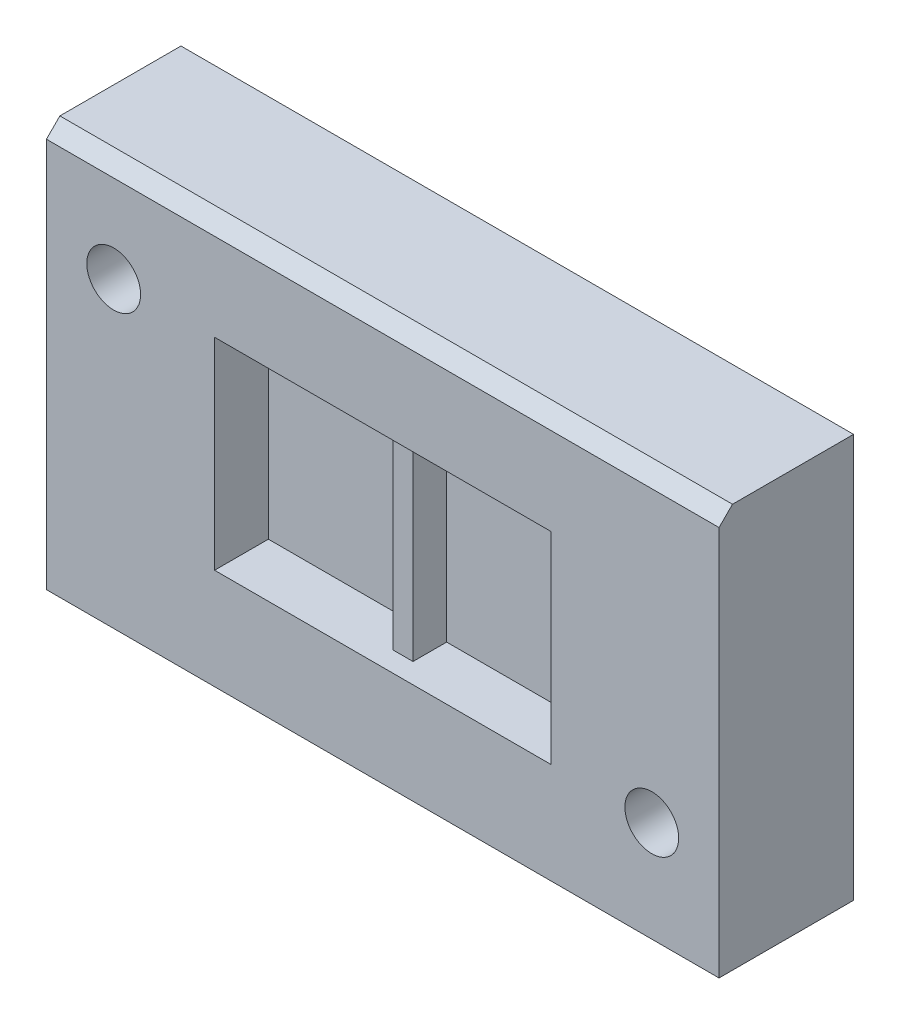
ISO-10303-21;
HEADER;
FILE_DESCRIPTION(('STEP AP214'),'2;1');
FILE_NAME('part.step','',(''),(''),'','','');
FILE_SCHEMA(('AUTOMOTIVE_DESIGN { 1 0 10303 214 1 1 1 1 }'));
ENDSEC;
DATA;
#1=APPLICATION_CONTEXT('core data for automotive mechanical design processes');
#2=APPLICATION_PROTOCOL_DEFINITION('international standard','automotive_design',2000,#1);
#3=PRODUCT_CONTEXT('',#1,'mechanical');
#4=PRODUCT('Part','Part','',(#3));
#5=PRODUCT_RELATED_PRODUCT_CATEGORY('part','',(#4));
#6=PRODUCT_DEFINITION_FORMATION('','',#4);
#7=PRODUCT_DEFINITION_CONTEXT('part definition',#1,'design');
#8=PRODUCT_DEFINITION('design','',#6,#7);
#9=PRODUCT_DEFINITION_SHAPE('','',#8);
#10=(LENGTH_UNIT() NAMED_UNIT(*) SI_UNIT(.MILLI.,.METRE.));
#11=(NAMED_UNIT(*) PLANE_ANGLE_UNIT() SI_UNIT($,.RADIAN.));
#12=(NAMED_UNIT(*) SI_UNIT($,.STERADIAN.) SOLID_ANGLE_UNIT());
#13=UNCERTAINTY_MEASURE_WITH_UNIT(LENGTH_MEASURE(1.E-05),#10,'distance_accuracy_value','');
#14=(GEOMETRIC_REPRESENTATION_CONTEXT(3) GLOBAL_UNCERTAINTY_ASSIGNED_CONTEXT((#13)) GLOBAL_UNIT_ASSIGNED_CONTEXT((#10,
#11,#12)) REPRESENTATION_CONTEXT('',''));
#15=CARTESIAN_POINT('',(0.,0.,0.));
#16=DIRECTION('',(0.,0.,1.));
#17=DIRECTION('',(1.,0.,0.));
#18=AXIS2_PLACEMENT_3D('',#15,#16,#17);
#19=CARTESIAN_POINT('',(0.,0.,12.));
#20=DIRECTION('',(0.,0.,-1.));
#21=DIRECTION('',(-1.,0.,0.));
#22=AXIS2_PLACEMENT_3D('',#19,#20,#21);
#23=PLANE('',#22);
#24=DIRECTION('',(0.,-1.,0.));
#25=VECTOR('',#24,1.);
#26=CARTESIAN_POINT('',(-1.5,0.,12.));
#27=LINE('',#26,#25);
#28=CARTESIAN_POINT('',(-1.5,15.,12.));
#29=VERTEX_POINT('',#28);
#30=CARTESIAN_POINT('',(-1.5,-15.,12.));
#31=VERTEX_POINT('',#30);
#32=EDGE_CURVE('E140',#29,#31,#27,.T.);
#33=ORIENTED_EDGE('',*,*,#32,.F.);
#34=DIRECTION('',(-1.,0.,0.));
#35=VECTOR('',#34,1.);
#36=CARTESIAN_POINT('',(-25.,15.,12.));
#37=LINE('',#36,#35);
#38=CARTESIAN_POINT('',(-25.,15.,12.));
#39=VERTEX_POINT('',#38);
#40=EDGE_CURVE('E260',#29,#39,#37,.T.);
#41=ORIENTED_EDGE('',*,*,#40,.T.);
#42=DIRECTION('',(0.,-1.,0.));
#43=VECTOR('',#42,1.);
#44=CARTESIAN_POINT('',(-25.,-15.,12.));
#45=LINE('',#44,#43);
#46=CARTESIAN_POINT('',(-25.,-15.,12.));
#47=VERTEX_POINT('',#46);
#48=EDGE_CURVE('E143',#39,#47,#45,.T.);
#49=ORIENTED_EDGE('',*,*,#48,.T.);
#50=DIRECTION('',(1.,0.,0.));
#51=VECTOR('',#50,1.);
#52=CARTESIAN_POINT('',(-25.,-15.,12.));
#53=LINE('',#52,#51);
#54=EDGE_CURVE('E137',#47,#31,#53,.T.);
#55=ORIENTED_EDGE('',*,*,#54,.T.);
#56=EDGE_LOOP('',(#33,#41,#49,#55));
#57=FACE_BOUND('',#56,.T.);
#58=ADVANCED_FACE('F43',(#57),#23,.F.);
#59=CARTESIAN_POINT('',(-50.,-30.,20.));
#60=DIRECTION('',(1.,0.,0.));
#61=DIRECTION('',(0.,0.,-1.));
#62=AXIS2_PLACEMENT_3D('',#59,#60,#61);
#63=PLANE('',#62);
#64=DIRECTION('',(0.,-1.,0.));
#65=VECTOR('',#64,1.);
#66=CARTESIAN_POINT('',(-50.,-30.,20.));
#67=LINE('',#66,#65);
#68=CARTESIAN_POINT('',(-50.,28.,20.));
#69=VERTEX_POINT('',#68);
#70=CARTESIAN_POINT('',(-50.,-30.,20.));
#71=VERTEX_POINT('',#70);
#72=EDGE_CURVE('E180',#69,#71,#67,.T.);
#73=ORIENTED_EDGE('',*,*,#72,.F.);
#74=DIRECTION('',(0.,-0.707106781186548,0.707106781186548));
#75=VECTOR('',#74,1.);
#76=CARTESIAN_POINT('',(-50.,28.,20.));
#77=LINE('',#76,#75);
#78=CARTESIAN_POINT('',(-50.,30.,18.));
#79=VERTEX_POINT('',#78);
#80=EDGE_CURVE('E66',#69,#79,#77,.F.);
#81=ORIENTED_EDGE('',*,*,#80,.T.);
#82=DIRECTION('',(0.,0.,-1.));
#83=VECTOR('',#82,1.);
#84=CARTESIAN_POINT('',(-50.,30.,20.));
#85=LINE('',#84,#83);
#86=CARTESIAN_POINT('',(-50.,30.,0.));
#87=VERTEX_POINT('',#86);
#88=EDGE_CURVE('E201',#79,#87,#85,.T.);
#89=ORIENTED_EDGE('',*,*,#88,.T.);
#90=DIRECTION('',(0.,-1.,0.));
#91=VECTOR('',#90,1.);
#92=CARTESIAN_POINT('',(-50.,-30.,0.));
#93=LINE('',#92,#91);
#94=CARTESIAN_POINT('',(-50.,-30.,0.));
#95=VERTEX_POINT('',#94);
#96=EDGE_CURVE('E202',#87,#95,#93,.T.);
#97=ORIENTED_EDGE('',*,*,#96,.T.);
#98=DIRECTION('',(0.,0.,-1.));
#99=VECTOR('',#98,1.);
#100=CARTESIAN_POINT('',(-50.,-30.,20.));
#101=LINE('',#100,#99);
#102=EDGE_CURVE('E164',#71,#95,#101,.T.);
#103=ORIENTED_EDGE('',*,*,#102,.F.);
#104=EDGE_LOOP('',(#73,#81,#89,#97,#103));
#105=FACE_BOUND('',#104,.T.);
#106=ADVANCED_FACE('F187',(#105),#63,.F.);
#107=CARTESIAN_POINT('',(-50.,-30.,20.));
#108=DIRECTION('',(0.,1.,0.));
#109=DIRECTION('',(0.,0.,1.));
#110=AXIS2_PLACEMENT_3D('',#107,#108,#109);
#111=PLANE('',#110);
#112=DIRECTION('',(1.,0.,0.));
#113=VECTOR('',#112,1.);
#114=CARTESIAN_POINT('',(-50.,-30.,0.));
#115=LINE('',#114,#113);
#116=CARTESIAN_POINT('',(50.,-30.,0.));
#117=VERTEX_POINT('',#116);
#118=EDGE_CURVE('E204',#95,#117,#115,.T.);
#119=ORIENTED_EDGE('',*,*,#118,.T.);
#120=DIRECTION('',(0.,0.,-1.));
#121=VECTOR('',#120,1.);
#122=CARTESIAN_POINT('',(50.,-30.,20.));
#123=LINE('',#122,#121);
#124=CARTESIAN_POINT('',(50.,-30.,20.));
#125=VERTEX_POINT('',#124);
#126=EDGE_CURVE('E168',#125,#117,#123,.T.);
#127=ORIENTED_EDGE('',*,*,#126,.F.);
#128=DIRECTION('',(1.,0.,0.));
#129=VECTOR('',#128,1.);
#130=CARTESIAN_POINT('',(-50.,-30.,20.));
#131=LINE('',#130,#129);
#132=EDGE_CURVE('E189',#71,#125,#131,.T.);
#133=ORIENTED_EDGE('',*,*,#132,.F.);
#134=ORIENTED_EDGE('',*,*,#102,.T.);
#135=EDGE_LOOP('',(#119,#127,#133,#134));
#136=FACE_BOUND('',#135,.T.);
#137=ADVANCED_FACE('F238',(#136),#111,.F.);
#138=CARTESIAN_POINT('',(50.,-30.,20.));
#139=DIRECTION('',(-1.,0.,0.));
#140=DIRECTION('',(0.,0.,1.));
#141=AXIS2_PLACEMENT_3D('',#138,#139,#140);
#142=PLANE('',#141);
#143=DIRECTION('',(0.,0.,-1.));
#144=VECTOR('',#143,1.);
#145=CARTESIAN_POINT('',(50.,30.,20.));
#146=LINE('',#145,#144);
#147=CARTESIAN_POINT('',(50.,30.,18.));
#148=VERTEX_POINT('',#147);
#149=CARTESIAN_POINT('',(50.,30.,0.));
#150=VERTEX_POINT('',#149);
#151=EDGE_CURVE('E210',#148,#150,#146,.T.);
#152=ORIENTED_EDGE('',*,*,#151,.F.);
#153=DIRECTION('',(0.,0.707106781186548,-0.707106781186548));
#154=VECTOR('',#153,1.);
#155=CARTESIAN_POINT('',(50.,28.,20.));
#156=LINE('',#155,#154);
#157=CARTESIAN_POINT('',(50.,28.,20.));
#158=VERTEX_POINT('',#157);
#159=EDGE_CURVE('E11',#148,#158,#156,.F.);
#160=ORIENTED_EDGE('',*,*,#159,.T.);
#161=DIRECTION('',(0.,1.,0.));
#162=VECTOR('',#161,1.);
#163=CARTESIAN_POINT('',(50.,-30.,20.));
#164=LINE('',#163,#162);
#165=EDGE_CURVE('E183',#125,#158,#164,.T.);
#166=ORIENTED_EDGE('',*,*,#165,.F.);
#167=ORIENTED_EDGE('',*,*,#126,.T.);
#168=DIRECTION('',(0.,1.,0.));
#169=VECTOR('',#168,1.);
#170=CARTESIAN_POINT('',(50.,-30.,0.));
#171=LINE('',#170,#169);
#172=EDGE_CURVE('E194',#117,#150,#171,.T.);
#173=ORIENTED_EDGE('',*,*,#172,.T.);
#174=EDGE_LOOP('',(#152,#160,#166,#167,#173));
#175=FACE_BOUND('',#174,.T.);
#176=ADVANCED_FACE('F215',(#175),#142,.F.);
#177=CARTESIAN_POINT('',(-50.,30.,20.));
#178=DIRECTION('',(0.,-1.,0.));
#179=DIRECTION('',(0.,0.,-1.));
#180=AXIS2_PLACEMENT_3D('',#177,#178,#179);
#181=PLANE('',#180);
#182=ORIENTED_EDGE('',*,*,#88,.F.);
#183=DIRECTION('',(1.,0.,0.));
#184=VECTOR('',#183,1.);
#185=CARTESIAN_POINT('',(-50.,30.,18.));
#186=LINE('',#185,#184);
#187=EDGE_CURVE('E52',#79,#148,#186,.T.);
#188=ORIENTED_EDGE('',*,*,#187,.T.);
#189=ORIENTED_EDGE('',*,*,#151,.T.);
#190=DIRECTION('',(-1.,0.,0.));
#191=VECTOR('',#190,1.);
#192=CARTESIAN_POINT('',(-50.,30.,0.));
#193=LINE('',#192,#191);
#194=EDGE_CURVE('E190',#150,#87,#193,.T.);
#195=ORIENTED_EDGE('',*,*,#194,.T.);
#196=EDGE_LOOP('',(#182,#188,#189,#195));
#197=FACE_BOUND('',#196,.T.);
#198=ADVANCED_FACE('F222',(#197),#181,.F.);
#199=CARTESIAN_POINT('',(0.,0.,20.));
#200=DIRECTION('',(0.,0.,-1.));
#201=DIRECTION('',(-1.,0.,0.));
#202=AXIS2_PLACEMENT_3D('',#199,#200,#201);
#203=PLANE('',#202);
#204=CARTESIAN_POINT('',(40.,-15.,20.));
#205=DIRECTION('',(0.,0.,1.));
#206=DIRECTION('',(1.,0.,0.));
#207=AXIS2_PLACEMENT_3D('',#204,#205,#206);
#208=CIRCLE('',#207,4.);
#209=CARTESIAN_POINT('',(44.,-15.,20.));
#210=VERTEX_POINT('',#209);
#211=EDGE_CURVE('E298',#210,#210,#208,.T.);
#212=ORIENTED_EDGE('',*,*,#211,.F.);
#213=EDGE_LOOP('',(#212));
#214=FACE_BOUND('',#213,.T.);
#215=CARTESIAN_POINT('',(-40.,15.,20.));
#216=DIRECTION('',(0.,0.,1.));
#217=DIRECTION('',(1.,0.,0.));
#218=AXIS2_PLACEMENT_3D('',#215,#216,#217);
#219=CIRCLE('',#218,4.);
#220=CARTESIAN_POINT('',(-36.,15.,20.));
#221=VERTEX_POINT('',#220);
#222=EDGE_CURVE('E292',#221,#221,#219,.T.);
#223=ORIENTED_EDGE('',*,*,#222,.F.);
#224=EDGE_LOOP('',(#223));
#225=FACE_BOUND('',#224,.T.);
#226=DIRECTION('',(1.,0.,0.));
#227=VECTOR('',#226,1.);
#228=CARTESIAN_POINT('',(-25.,-15.,20.));
#229=LINE('',#228,#227);
#230=CARTESIAN_POINT('',(-25.,-15.,20.));
#231=VERTEX_POINT('',#230);
#232=CARTESIAN_POINT('',(25.,-15.,20.));
#233=VERTEX_POINT('',#232);
#234=EDGE_CURVE('E267',#231,#233,#229,.T.);
#235=ORIENTED_EDGE('',*,*,#234,.F.);
#236=DIRECTION('',(0.,-1.,0.));
#237=VECTOR('',#236,1.);
#238=CARTESIAN_POINT('',(-25.,-15.,20.));
#239=LINE('',#238,#237);
#240=CARTESIAN_POINT('',(-25.,15.,20.));
#241=VERTEX_POINT('',#240);
#242=EDGE_CURVE('E265',#241,#231,#239,.T.);
#243=ORIENTED_EDGE('',*,*,#242,.F.);
#244=DIRECTION('',(-1.,0.,0.));
#245=VECTOR('',#244,1.);
#246=CARTESIAN_POINT('',(-25.,15.,20.));
#247=LINE('',#246,#245);
#248=CARTESIAN_POINT('',(25.,15.,20.));
#249=VERTEX_POINT('',#248);
#250=EDGE_CURVE('E274',#249,#241,#247,.T.);
#251=ORIENTED_EDGE('',*,*,#250,.F.);
#252=DIRECTION('',(0.,1.,0.));
#253=VECTOR('',#252,1.);
#254=CARTESIAN_POINT('',(25.,-15.,20.));
#255=LINE('',#254,#253);
#256=EDGE_CURVE('E271',#233,#249,#255,.T.);
#257=ORIENTED_EDGE('',*,*,#256,.F.);
#258=EDGE_LOOP('',(#235,#243,#251,#257));
#259=FACE_BOUND('',#258,.T.);
#260=ORIENTED_EDGE('',*,*,#165,.T.);
#261=DIRECTION('',(-1.,0.,0.));
#262=VECTOR('',#261,1.);
#263=CARTESIAN_POINT('',(0.,28.,20.));
#264=LINE('',#263,#262);
#265=EDGE_CURVE('E173',#158,#69,#264,.T.);
#266=ORIENTED_EDGE('',*,*,#265,.T.);
#267=ORIENTED_EDGE('',*,*,#72,.T.);
#268=ORIENTED_EDGE('',*,*,#132,.T.);
#269=EDGE_LOOP('',(#260,#266,#267,#268));
#270=FACE_BOUND('',#269,.T.);
#271=ADVANCED_FACE('F179',(#214,#225,#259,#270),#203,.F.);
#272=CARTESIAN_POINT('',(0.,0.,0.));
#273=DIRECTION('',(0.,0.,-1.));
#274=DIRECTION('',(-1.,0.,0.));
#275=AXIS2_PLACEMENT_3D('',#272,#273,#274);
#276=PLANE('',#275);
#277=ORIENTED_EDGE('',*,*,#172,.F.);
#278=ORIENTED_EDGE('',*,*,#118,.F.);
#279=ORIENTED_EDGE('',*,*,#96,.F.);
#280=ORIENTED_EDGE('',*,*,#194,.F.);
#281=EDGE_LOOP('',(#277,#278,#279,#280));
#282=FACE_BOUND('',#281,.T.);
#283=CARTESIAN_POINT('',(40.,-15.,0.));
#284=DIRECTION('',(0.,0.,1.));
#285=DIRECTION('',(1.,0.,0.));
#286=AXIS2_PLACEMENT_3D('',#283,#284,#285);
#287=CIRCLE('',#286,4.);
#288=CARTESIAN_POINT('',(44.,-15.,0.));
#289=VERTEX_POINT('',#288);
#290=EDGE_CURVE('E295',#289,#289,#287,.T.);
#291=ORIENTED_EDGE('',*,*,#290,.T.);
#292=EDGE_LOOP('',(#291));
#293=FACE_BOUND('',#292,.T.);
#294=CARTESIAN_POINT('',(-40.,15.,0.));
#295=DIRECTION('',(0.,0.,1.));
#296=DIRECTION('',(1.,0.,0.));
#297=AXIS2_PLACEMENT_3D('',#294,#295,#296);
#298=CIRCLE('',#297,4.);
#299=CARTESIAN_POINT('',(-36.,15.,0.));
#300=VERTEX_POINT('',#299);
#301=EDGE_CURVE('E268',#300,#300,#298,.T.);
#302=ORIENTED_EDGE('',*,*,#301,.T.);
#303=EDGE_LOOP('',(#302));
#304=FACE_BOUND('',#303,.T.);
#305=ADVANCED_FACE('F219',(#282,#293,#304),#276,.T.);
#306=CARTESIAN_POINT('',(-25.,-15.,12.));
#307=DIRECTION('',(-1.,0.,0.));
#308=DIRECTION('',(0.,0.,1.));
#309=AXIS2_PLACEMENT_3D('',#306,#307,#308);
#310=PLANE('',#309);
#311=ORIENTED_EDGE('',*,*,#242,.T.);
#312=DIRECTION('',(0.,0.,1.));
#313=VECTOR('',#312,1.);
#314=CARTESIAN_POINT('',(-25.,-15.,12.));
#315=LINE('',#314,#313);
#316=EDGE_CURVE('E197',#47,#231,#315,.T.);
#317=ORIENTED_EDGE('',*,*,#316,.F.);
#318=ORIENTED_EDGE('',*,*,#48,.F.);
#319=DIRECTION('',(0.,0.,1.));
#320=VECTOR('',#319,1.);
#321=CARTESIAN_POINT('',(-25.,15.,12.));
#322=LINE('',#321,#320);
#323=EDGE_CURVE('E205',#39,#241,#322,.T.);
#324=ORIENTED_EDGE('',*,*,#323,.T.);
#325=EDGE_LOOP('',(#311,#317,#318,#324));
#326=FACE_BOUND('',#325,.T.);
#327=ADVANCED_FACE('F289',(#326),#310,.F.);
#328=CARTESIAN_POINT('',(-25.,15.,12.));
#329=DIRECTION('',(0.,1.,0.));
#330=DIRECTION('',(0.,0.,1.));
#331=AXIS2_PLACEMENT_3D('',#328,#329,#330);
#332=PLANE('',#331);
#333=DIRECTION('',(-1.,0.,0.));
#334=VECTOR('',#333,1.);
#335=CARTESIAN_POINT('',(-25.,15.,17.));
#336=LINE('',#335,#334);
#337=CARTESIAN_POINT('',(-1.5,15.,17.));
#338=VERTEX_POINT('',#337);
#339=CARTESIAN_POINT('',(1.5,15.,17.));
#340=VERTEX_POINT('',#339);
#341=EDGE_CURVE('E301',#338,#340,#336,.F.);
#342=ORIENTED_EDGE('',*,*,#341,.T.);
#343=DIRECTION('',(0.,0.,-1.));
#344=VECTOR('',#343,1.);
#345=CARTESIAN_POINT('',(1.5,15.,12.));
#346=LINE('',#345,#344);
#347=CARTESIAN_POINT('',(1.5,15.,12.));
#348=VERTEX_POINT('',#347);
#349=EDGE_CURVE('E305',#340,#348,#346,.T.);
#350=ORIENTED_EDGE('',*,*,#349,.T.);
#351=CARTESIAN_POINT('',(25.,15.,12.));
#352=VERTEX_POINT('',#351);
#353=EDGE_CURVE('E256',#352,#348,#37,.T.);
#354=ORIENTED_EDGE('',*,*,#353,.F.);
#355=DIRECTION('',(0.,0.,1.));
#356=VECTOR('',#355,1.);
#357=CARTESIAN_POINT('',(25.,15.,12.));
#358=LINE('',#357,#356);
#359=EDGE_CURVE('E278',#352,#249,#358,.T.);
#360=ORIENTED_EDGE('',*,*,#359,.T.);
#361=ORIENTED_EDGE('',*,*,#250,.T.);
#362=ORIENTED_EDGE('',*,*,#323,.F.);
#363=ORIENTED_EDGE('',*,*,#40,.F.);
#364=DIRECTION('',(0.,0.,-1.));
#365=VECTOR('',#364,1.);
#366=CARTESIAN_POINT('',(-1.5,15.,12.));
#367=LINE('',#366,#365);
#368=EDGE_CURVE('E158',#338,#29,#367,.T.);
#369=ORIENTED_EDGE('',*,*,#368,.F.);
#370=EDGE_LOOP('',(#342,#350,#354,#360,#361,#362,#363,#369));
#371=FACE_BOUND('',#370,.T.);
#372=ADVANCED_FACE('F287',(#371),#332,.F.);
#373=CARTESIAN_POINT('',(25.,-15.,12.));
#374=DIRECTION('',(1.,0.,0.));
#375=DIRECTION('',(0.,0.,-1.));
#376=AXIS2_PLACEMENT_3D('',#373,#374,#375);
#377=PLANE('',#376);
#378=ORIENTED_EDGE('',*,*,#256,.T.);
#379=ORIENTED_EDGE('',*,*,#359,.F.);
#380=DIRECTION('',(0.,1.,0.));
#381=VECTOR('',#380,1.);
#382=CARTESIAN_POINT('',(25.,-15.,12.));
#383=LINE('',#382,#381);
#384=CARTESIAN_POINT('',(25.,-15.,12.));
#385=VERTEX_POINT('',#384);
#386=EDGE_CURVE('E146',#385,#352,#383,.T.);
#387=ORIENTED_EDGE('',*,*,#386,.F.);
#388=DIRECTION('',(0.,0.,1.));
#389=VECTOR('',#388,1.);
#390=CARTESIAN_POINT('',(25.,-15.,12.));
#391=LINE('',#390,#389);
#392=EDGE_CURVE('E262',#385,#233,#391,.T.);
#393=ORIENTED_EDGE('',*,*,#392,.T.);
#394=EDGE_LOOP('',(#378,#379,#387,#393));
#395=FACE_BOUND('',#394,.T.);
#396=ADVANCED_FACE('F251',(#395),#377,.F.);
#397=CARTESIAN_POINT('',(-25.,-15.,12.));
#398=DIRECTION('',(0.,-1.,0.));
#399=DIRECTION('',(0.,0.,-1.));
#400=AXIS2_PLACEMENT_3D('',#397,#398,#399);
#401=PLANE('',#400);
#402=CARTESIAN_POINT('',(1.5,-15.,12.));
#403=VERTEX_POINT('',#402);
#404=EDGE_CURVE('E147',#403,#385,#53,.T.);
#405=ORIENTED_EDGE('',*,*,#404,.F.);
#406=DIRECTION('',(0.,0.,1.));
#407=VECTOR('',#406,1.);
#408=CARTESIAN_POINT('',(1.5,-15.,12.));
#409=LINE('',#408,#407);
#410=CARTESIAN_POINT('',(1.5,-15.,17.));
#411=VERTEX_POINT('',#410);
#412=EDGE_CURVE('E307',#403,#411,#409,.T.);
#413=ORIENTED_EDGE('',*,*,#412,.T.);
#414=DIRECTION('',(1.,0.,0.));
#415=VECTOR('',#414,1.);
#416=CARTESIAN_POINT('',(-25.,-15.,17.));
#417=LINE('',#416,#415);
#418=CARTESIAN_POINT('',(-1.5,-15.,17.));
#419=VERTEX_POINT('',#418);
#420=EDGE_CURVE('E154',#411,#419,#417,.F.);
#421=ORIENTED_EDGE('',*,*,#420,.T.);
#422=DIRECTION('',(0.,0.,1.));
#423=VECTOR('',#422,1.);
#424=CARTESIAN_POINT('',(-1.5,-15.,12.));
#425=LINE('',#424,#423);
#426=EDGE_CURVE('E150',#31,#419,#425,.T.);
#427=ORIENTED_EDGE('',*,*,#426,.F.);
#428=ORIENTED_EDGE('',*,*,#54,.F.);
#429=ORIENTED_EDGE('',*,*,#316,.T.);
#430=ORIENTED_EDGE('',*,*,#234,.T.);
#431=ORIENTED_EDGE('',*,*,#392,.F.);
#432=EDGE_LOOP('',(#405,#413,#421,#427,#428,#429,#430,#431));
#433=FACE_BOUND('',#432,.T.);
#434=ADVANCED_FACE('F152',(#433),#401,.F.);
#435=ORIENTED_EDGE('',*,*,#353,.T.);
#436=DIRECTION('',(0.,-1.,0.));
#437=VECTOR('',#436,1.);
#438=CARTESIAN_POINT('',(1.5,0.,12.));
#439=LINE('',#438,#437);
#440=EDGE_CURVE('E163',#348,#403,#439,.T.);
#441=ORIENTED_EDGE('',*,*,#440,.T.);
#442=ORIENTED_EDGE('',*,*,#404,.T.);
#443=ORIENTED_EDGE('',*,*,#386,.T.);
#444=EDGE_LOOP('',(#435,#441,#442,#443));
#445=FACE_BOUND('',#444,.T.);
#446=ADVANCED_FACE('F232',(#445),#23,.F.);
#447=CARTESIAN_POINT('',(-40.,15.,0.));
#448=DIRECTION('',(0.,0.,1.));
#449=DIRECTION('',(1.,0.,0.));
#450=AXIS2_PLACEMENT_3D('',#447,#448,#449);
#451=CYLINDRICAL_SURFACE('',#450,4.);
#452=ORIENTED_EDGE('',*,*,#301,.F.);
#453=EDGE_LOOP('',(#452));
#454=FACE_BOUND('',#453,.T.);
#455=ORIENTED_EDGE('',*,*,#222,.T.);
#456=EDGE_LOOP('',(#455));
#457=FACE_BOUND('',#456,.T.);
#458=ADVANCED_FACE('F242',(#454,#457),#451,.F.);
#459=CARTESIAN_POINT('',(40.,-15.,0.));
#460=DIRECTION('',(0.,0.,1.));
#461=DIRECTION('',(1.,0.,0.));
#462=AXIS2_PLACEMENT_3D('',#459,#460,#461);
#463=CYLINDRICAL_SURFACE('',#462,4.);
#464=ORIENTED_EDGE('',*,*,#290,.F.);
#465=EDGE_LOOP('',(#464));
#466=FACE_BOUND('',#465,.T.);
#467=ORIENTED_EDGE('',*,*,#211,.T.);
#468=EDGE_LOOP('',(#467));
#469=FACE_BOUND('',#468,.T.);
#470=ADVANCED_FACE('F249',(#466,#469),#463,.F.);
#471=CARTESIAN_POINT('',(0.,-10.,17.));
#472=DIRECTION('',(0.,0.,-1.));
#473=DIRECTION('',(0.,1.,0.));
#474=AXIS2_PLACEMENT_3D('',#471,#472,#473);
#475=PLANE('',#474);
#476=ORIENTED_EDGE('',*,*,#341,.F.);
#477=DIRECTION('',(0.,1.,0.));
#478=VECTOR('',#477,1.);
#479=CARTESIAN_POINT('',(-1.5,0.,17.));
#480=LINE('',#479,#478);
#481=EDGE_CURVE('E310',#419,#338,#480,.T.);
#482=ORIENTED_EDGE('',*,*,#481,.F.);
#483=ORIENTED_EDGE('',*,*,#420,.F.);
#484=DIRECTION('',(0.,1.,0.));
#485=VECTOR('',#484,1.);
#486=CARTESIAN_POINT('',(1.5,0.,17.));
#487=LINE('',#486,#485);
#488=EDGE_CURVE('E159',#411,#340,#487,.T.);
#489=ORIENTED_EDGE('',*,*,#488,.T.);
#490=EDGE_LOOP('',(#476,#482,#483,#489));
#491=FACE_BOUND('',#490,.T.);
#492=ADVANCED_FACE('F316',(#491),#475,.F.);
#493=CARTESIAN_POINT('',(1.5,0.,10.));
#494=DIRECTION('',(1.,0.,0.));
#495=DIRECTION('',(0.,0.,-1.));
#496=AXIS2_PLACEMENT_3D('',#493,#494,#495);
#497=PLANE('',#496);
#498=ORIENTED_EDGE('',*,*,#440,.F.);
#499=ORIENTED_EDGE('',*,*,#349,.F.);
#500=ORIENTED_EDGE('',*,*,#488,.F.);
#501=ORIENTED_EDGE('',*,*,#412,.F.);
#502=EDGE_LOOP('',(#498,#499,#500,#501));
#503=FACE_BOUND('',#502,.T.);
#504=ADVANCED_FACE('F228',(#503),#497,.T.);
#505=CARTESIAN_POINT('',(-1.5,0.,10.));
#506=DIRECTION('',(1.,0.,0.));
#507=DIRECTION('',(0.,0.,-1.));
#508=AXIS2_PLACEMENT_3D('',#505,#506,#507);
#509=PLANE('',#508);
#510=ORIENTED_EDGE('',*,*,#481,.T.);
#511=ORIENTED_EDGE('',*,*,#368,.T.);
#512=ORIENTED_EDGE('',*,*,#32,.T.);
#513=ORIENTED_EDGE('',*,*,#426,.T.);
#514=EDGE_LOOP('',(#510,#511,#512,#513));
#515=FACE_BOUND('',#514,.T.);
#516=ADVANCED_FACE('F162',(#515),#509,.F.);
#517=CARTESIAN_POINT('',(0.,28.,20.));
#518=DIRECTION('',(0.,-0.707106781186547,-0.707106781186547));
#519=DIRECTION('',(-1.,0.,0.));
#520=AXIS2_PLACEMENT_3D('',#517,#518,#519);
#521=PLANE('',#520);
#522=ORIENTED_EDGE('',*,*,#159,.F.);
#523=ORIENTED_EDGE('',*,*,#187,.F.);
#524=ORIENTED_EDGE('',*,*,#80,.F.);
#525=ORIENTED_EDGE('',*,*,#265,.F.);
#526=EDGE_LOOP('',(#522,#523,#524,#525));
#527=FACE_BOUND('',#526,.T.);
#528=ADVANCED_FACE('F46',(#527),#521,.F.);
#529=CLOSED_SHELL('',(#58,#106,#137,#176,#198,#271,#305,#327,#372,#396,#434,#446,#458,#470,#492,
#504,#516,#528));
#530=MANIFOLD_SOLID_BREP('B2',#529);
#531=ADVANCED_BREP_SHAPE_REPRESENTATION('',(#18,#530),#14);
#532=SHAPE_DEFINITION_REPRESENTATION(#9,#531);
ENDSEC;
END-ISO-10303-21;
